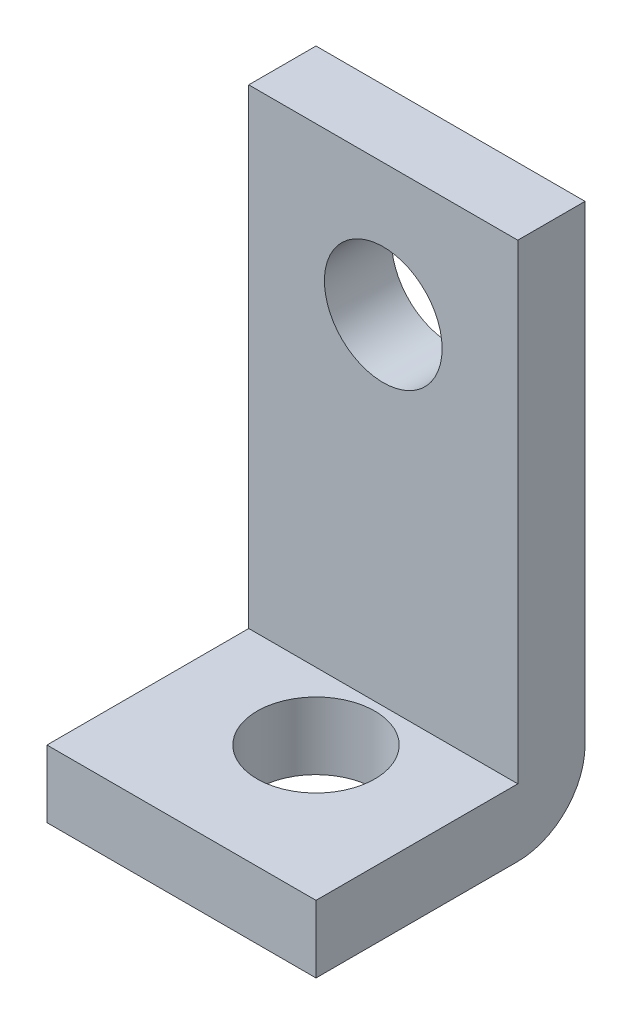
ISO-10303-21;
HEADER;
FILE_DESCRIPTION(('STEP AP214'),'2;1');
FILE_NAME('part.step','',(''),(''),'','','');
FILE_SCHEMA(('AUTOMOTIVE_DESIGN { 1 0 10303 214 1 1 1 1 }'));
ENDSEC;
DATA;
#1=APPLICATION_CONTEXT('core data for automotive mechanical design processes');
#2=APPLICATION_PROTOCOL_DEFINITION('international standard','automotive_design',2000,#1);
#3=PRODUCT_CONTEXT('',#1,'mechanical');
#4=PRODUCT('Part','Part','',(#3));
#5=PRODUCT_RELATED_PRODUCT_CATEGORY('part','',(#4));
#6=PRODUCT_DEFINITION_FORMATION('','',#4);
#7=PRODUCT_DEFINITION_CONTEXT('part definition',#1,'design');
#8=PRODUCT_DEFINITION('design','',#6,#7);
#9=PRODUCT_DEFINITION_SHAPE('','',#8);
#10=(LENGTH_UNIT() NAMED_UNIT(*) SI_UNIT(.MILLI.,.METRE.));
#11=(NAMED_UNIT(*) PLANE_ANGLE_UNIT() SI_UNIT($,.RADIAN.));
#12=(NAMED_UNIT(*) SI_UNIT($,.STERADIAN.) SOLID_ANGLE_UNIT());
#13=UNCERTAINTY_MEASURE_WITH_UNIT(LENGTH_MEASURE(1.E-05),#10,'distance_accuracy_value','');
#14=(GEOMETRIC_REPRESENTATION_CONTEXT(3) GLOBAL_UNCERTAINTY_ASSIGNED_CONTEXT((#13)) GLOBAL_UNIT_ASSIGNED_CONTEXT((#10,
#11,#12)) REPRESENTATION_CONTEXT('',''));
#15=CARTESIAN_POINT('',(0.,0.,0.));
#16=DIRECTION('',(0.,0.,1.));
#17=DIRECTION('',(1.,0.,0.));
#18=AXIS2_PLACEMENT_3D('',#15,#16,#17);
#19=CARTESIAN_POINT('',(-5.08,2.54,0.));
#20=DIRECTION('',(-1.,0.,0.));
#21=DIRECTION('',(0.,0.,1.));
#22=AXIS2_PLACEMENT_3D('',#19,#20,#21);
#23=PLANE('',#22);
#24=DIRECTION('',(0.,-1.,0.));
#25=VECTOR('',#24,1.);
#26=CARTESIAN_POINT('',(-5.08,20.32,-5.08));
#27=LINE('',#26,#25);
#28=CARTESIAN_POINT('',(-5.08,20.32,-5.08));
#29=VERTEX_POINT('',#28);
#30=CARTESIAN_POINT('',(-5.08,2.54,-5.08));
#31=VERTEX_POINT('',#30);
#32=EDGE_CURVE('E143',#29,#31,#27,.T.);
#33=ORIENTED_EDGE('',*,*,#32,.T.);
#34=CARTESIAN_POINT('',(-5.08,2.54,-2.54));
#35=DIRECTION('',(-1.,0.,0.));
#36=DIRECTION('',(0.,0.,1.));
#37=AXIS2_PLACEMENT_3D('',#34,#35,#36);
#38=CIRCLE('',#37,2.54);
#39=CARTESIAN_POINT('',(-5.08,0.,-2.54));
#40=VERTEX_POINT('',#39);
#41=EDGE_CURVE('E11',#31,#40,#38,.T.);
#42=ORIENTED_EDGE('',*,*,#41,.T.);
#43=DIRECTION('',(0.,0.,-1.));
#44=VECTOR('',#43,1.);
#45=CARTESIAN_POINT('',(-5.08,0.,0.));
#46=LINE('',#45,#44);
#47=CARTESIAN_POINT('',(-5.08,0.,5.08));
#48=VERTEX_POINT('',#47);
#49=EDGE_CURVE('E172',#48,#40,#46,.T.);
#50=ORIENTED_EDGE('',*,*,#49,.F.);
#51=DIRECTION('',(0.,-1.,0.));
#52=VECTOR('',#51,1.);
#53=CARTESIAN_POINT('',(-5.08,2.54,5.08));
#54=LINE('',#53,#52);
#55=CARTESIAN_POINT('',(-5.08,2.54,5.08));
#56=VERTEX_POINT('',#55);
#57=EDGE_CURVE('E185',#56,#48,#54,.T.);
#58=ORIENTED_EDGE('',*,*,#57,.F.);
#59=DIRECTION('',(0.,0.,-1.));
#60=VECTOR('',#59,1.);
#61=CARTESIAN_POINT('',(-5.08,2.54,0.));
#62=LINE('',#61,#60);
#63=CARTESIAN_POINT('',(-5.08,2.54,-2.54));
#64=VERTEX_POINT('',#63);
#65=EDGE_CURVE('E111',#56,#64,#62,.T.);
#66=ORIENTED_EDGE('',*,*,#65,.T.);
#67=DIRECTION('',(0.,-1.,0.));
#68=VECTOR('',#67,1.);
#69=CARTESIAN_POINT('',(-5.08,20.32,-2.54));
#70=LINE('',#69,#68);
#71=CARTESIAN_POINT('',(-5.08,20.32,-2.54));
#72=VERTEX_POINT('',#71);
#73=EDGE_CURVE('E105',#72,#64,#70,.T.);
#74=ORIENTED_EDGE('',*,*,#73,.F.);
#75=DIRECTION('',(0.,0.,-1.));
#76=VECTOR('',#75,1.);
#77=CARTESIAN_POINT('',(-5.08,20.32,0.));
#78=LINE('',#77,#76);
#79=EDGE_CURVE('E108',#72,#29,#78,.T.);
#80=ORIENTED_EDGE('',*,*,#79,.T.);
#81=EDGE_LOOP('',(#33,#42,#50,#58,#66,#74,#80));
#82=FACE_BOUND('',#81,.T.);
#83=ADVANCED_FACE('F45',(#82),#23,.T.);
#84=CARTESIAN_POINT('',(0.,2.54,5.08));
#85=DIRECTION('',(0.,0.,-1.));
#86=DIRECTION('',(-1.,0.,0.));
#87=AXIS2_PLACEMENT_3D('',#84,#85,#86);
#88=PLANE('',#87);
#89=DIRECTION('',(1.,0.,0.));
#90=VECTOR('',#89,1.);
#91=CARTESIAN_POINT('',(0.,0.,5.08));
#92=LINE('',#91,#90);
#93=CARTESIAN_POINT('',(5.08,0.,5.08));
#94=VERTEX_POINT('',#93);
#95=EDGE_CURVE('E176',#48,#94,#92,.T.);
#96=ORIENTED_EDGE('',*,*,#95,.T.);
#97=DIRECTION('',(0.,-1.,0.));
#98=VECTOR('',#97,1.);
#99=CARTESIAN_POINT('',(5.08,2.54,5.08));
#100=LINE('',#99,#98);
#101=CARTESIAN_POINT('',(5.08,2.54,5.08));
#102=VERTEX_POINT('',#101);
#103=EDGE_CURVE('E168',#102,#94,#100,.T.);
#104=ORIENTED_EDGE('',*,*,#103,.F.);
#105=DIRECTION('',(1.,0.,0.));
#106=VECTOR('',#105,1.);
#107=CARTESIAN_POINT('',(0.,2.54,5.08));
#108=LINE('',#107,#106);
#109=EDGE_CURVE('E161',#56,#102,#108,.T.);
#110=ORIENTED_EDGE('',*,*,#109,.F.);
#111=ORIENTED_EDGE('',*,*,#57,.T.);
#112=EDGE_LOOP('',(#96,#104,#110,#111));
#113=FACE_BOUND('',#112,.T.);
#114=ADVANCED_FACE('F205',(#113),#88,.F.);
#115=CARTESIAN_POINT('',(0.,2.54,0.));
#116=DIRECTION('',(0.,-1.,0.));
#117=DIRECTION('',(0.,0.,-1.));
#118=AXIS2_PLACEMENT_3D('',#115,#116,#117);
#119=CYLINDRICAL_SURFACE('',#118,2.2225);
#120=CARTESIAN_POINT('',(0.,2.54,0.));
#121=DIRECTION('',(0.,1.,0.));
#122=DIRECTION('',(0.,0.,1.));
#123=AXIS2_PLACEMENT_3D('',#120,#121,#122);
#124=CIRCLE('',#123,2.2225);
#125=CARTESIAN_POINT('',(0.,2.54,2.2225));
#126=VERTEX_POINT('',#125);
#127=EDGE_CURVE('E151',#126,#126,#124,.T.);
#128=ORIENTED_EDGE('',*,*,#127,.T.);
#129=EDGE_LOOP('',(#128));
#130=FACE_BOUND('',#129,.T.);
#131=CARTESIAN_POINT('',(0.,0.,0.));
#132=DIRECTION('',(0.,1.,0.));
#133=DIRECTION('',(0.,0.,1.));
#134=AXIS2_PLACEMENT_3D('',#131,#132,#133);
#135=CIRCLE('',#134,2.2225);
#136=CARTESIAN_POINT('',(0.,0.,2.2225));
#137=VERTEX_POINT('',#136);
#138=EDGE_CURVE('E115',#137,#137,#135,.T.);
#139=ORIENTED_EDGE('',*,*,#138,.F.);
#140=EDGE_LOOP('',(#139));
#141=FACE_BOUND('',#140,.T.);
#142=ADVANCED_FACE('F221',(#130,#141),#119,.F.);
#143=CARTESIAN_POINT('',(5.08,2.54,0.));
#144=DIRECTION('',(-1.,0.,0.));
#145=DIRECTION('',(0.,0.,1.));
#146=AXIS2_PLACEMENT_3D('',#143,#144,#145);
#147=PLANE('',#146);
#148=DIRECTION('',(0.,0.,-1.));
#149=VECTOR('',#148,1.);
#150=CARTESIAN_POINT('',(5.08,0.,0.));
#151=LINE('',#150,#149);
#152=CARTESIAN_POINT('',(5.08,0.,-2.54));
#153=VERTEX_POINT('',#152);
#154=EDGE_CURVE('E156',#94,#153,#151,.T.);
#155=ORIENTED_EDGE('',*,*,#154,.T.);
#156=CARTESIAN_POINT('',(5.08,2.54,-2.54));
#157=DIRECTION('',(-1.,0.,0.));
#158=DIRECTION('',(0.,0.,1.));
#159=AXIS2_PLACEMENT_3D('',#156,#157,#158);
#160=CIRCLE('',#159,2.54);
#161=CARTESIAN_POINT('',(5.08,2.54,-5.08));
#162=VERTEX_POINT('',#161);
#163=EDGE_CURVE('E68',#153,#162,#160,.F.);
#164=ORIENTED_EDGE('',*,*,#163,.T.);
#165=DIRECTION('',(0.,-1.,0.));
#166=VECTOR('',#165,1.);
#167=CARTESIAN_POINT('',(5.08,20.32,-5.08));
#168=LINE('',#167,#166);
#169=CARTESIAN_POINT('',(5.08,20.32,-5.08));
#170=VERTEX_POINT('',#169);
#171=EDGE_CURVE('E146',#170,#162,#168,.T.);
#172=ORIENTED_EDGE('',*,*,#171,.F.);
#173=DIRECTION('',(0.,0.,-1.));
#174=VECTOR('',#173,1.);
#175=CARTESIAN_POINT('',(5.08,20.32,0.));
#176=LINE('',#175,#174);
#177=CARTESIAN_POINT('',(5.08,20.32,-2.54));
#178=VERTEX_POINT('',#177);
#179=EDGE_CURVE('E125',#178,#170,#176,.T.);
#180=ORIENTED_EDGE('',*,*,#179,.F.);
#181=DIRECTION('',(0.,-1.,0.));
#182=VECTOR('',#181,1.);
#183=CARTESIAN_POINT('',(5.08,20.32,-2.54));
#184=LINE('',#183,#182);
#185=CARTESIAN_POINT('',(5.08,2.54,-2.54));
#186=VERTEX_POINT('',#185);
#187=EDGE_CURVE('E116',#178,#186,#184,.T.);
#188=ORIENTED_EDGE('',*,*,#187,.T.);
#189=DIRECTION('',(0.,0.,-1.));
#190=VECTOR('',#189,1.);
#191=CARTESIAN_POINT('',(5.08,2.54,0.));
#192=LINE('',#191,#190);
#193=EDGE_CURVE('E165',#102,#186,#192,.T.);
#194=ORIENTED_EDGE('',*,*,#193,.F.);
#195=ORIENTED_EDGE('',*,*,#103,.T.);
#196=EDGE_LOOP('',(#155,#164,#172,#180,#188,#194,#195));
#197=FACE_BOUND('',#196,.T.);
#198=ADVANCED_FACE('F201',(#197),#147,.F.);
#199=CARTESIAN_POINT('',(0.,2.54,0.));
#200=DIRECTION('',(0.,1.,0.));
#201=DIRECTION('',(0.,0.,1.));
#202=AXIS2_PLACEMENT_3D('',#199,#200,#201);
#203=PLANE('',#202);
#204=ORIENTED_EDGE('',*,*,#127,.F.);
#205=EDGE_LOOP('',(#204));
#206=FACE_BOUND('',#205,.T.);
#207=DIRECTION('',(1.,0.,0.));
#208=VECTOR('',#207,1.);
#209=CARTESIAN_POINT('',(0.,2.54,-2.54));
#210=LINE('',#209,#208);
#211=EDGE_CURVE('E155',#64,#186,#210,.T.);
#212=ORIENTED_EDGE('',*,*,#211,.F.);
#213=ORIENTED_EDGE('',*,*,#65,.F.);
#214=ORIENTED_EDGE('',*,*,#109,.T.);
#215=ORIENTED_EDGE('',*,*,#193,.T.);
#216=EDGE_LOOP('',(#212,#213,#214,#215));
#217=FACE_BOUND('',#216,.T.);
#218=ADVANCED_FACE('F229',(#206,#217),#203,.T.);
#219=CARTESIAN_POINT('',(0.,0.,0.));
#220=DIRECTION('',(0.,1.,0.));
#221=DIRECTION('',(0.,0.,1.));
#222=AXIS2_PLACEMENT_3D('',#219,#220,#221);
#223=PLANE('',#222);
#224=ORIENTED_EDGE('',*,*,#138,.T.);
#225=EDGE_LOOP('',(#224));
#226=FACE_BOUND('',#225,.T.);
#227=ORIENTED_EDGE('',*,*,#49,.T.);
#228=DIRECTION('',(1.,0.,0.));
#229=VECTOR('',#228,1.);
#230=CARTESIAN_POINT('',(5.08,0.,-2.54));
#231=LINE('',#230,#229);
#232=EDGE_CURVE('E188',#40,#153,#231,.T.);
#233=ORIENTED_EDGE('',*,*,#232,.T.);
#234=ORIENTED_EDGE('',*,*,#154,.F.);
#235=ORIENTED_EDGE('',*,*,#95,.F.);
#236=EDGE_LOOP('',(#227,#233,#234,#235));
#237=FACE_BOUND('',#236,.T.);
#238=ADVANCED_FACE('F196',(#226,#237),#223,.F.);
#239=CARTESIAN_POINT('',(0.,20.32,-2.54));
#240=DIRECTION('',(0.,0.,-1.));
#241=DIRECTION('',(-1.,0.,0.));
#242=AXIS2_PLACEMENT_3D('',#239,#240,#241);
#243=PLANE('',#242);
#244=CARTESIAN_POINT('',(0.,15.3416,-2.54));
#245=DIRECTION('',(0.,0.,1.));
#246=DIRECTION('',(1.,0.,0.));
#247=AXIS2_PLACEMENT_3D('',#244,#245,#246);
#248=CIRCLE('',#247,2.2225);
#249=CARTESIAN_POINT('',(2.2225,15.3416,-2.54));
#250=VERTEX_POINT('',#249);
#251=EDGE_CURVE('E131',#250,#250,#248,.T.);
#252=ORIENTED_EDGE('',*,*,#251,.F.);
#253=EDGE_LOOP('',(#252));
#254=FACE_BOUND('',#253,.T.);
#255=ORIENTED_EDGE('',*,*,#73,.T.);
#256=ORIENTED_EDGE('',*,*,#211,.T.);
#257=ORIENTED_EDGE('',*,*,#187,.F.);
#258=DIRECTION('',(1.,0.,0.));
#259=VECTOR('',#258,1.);
#260=CARTESIAN_POINT('',(0.,20.32,-2.54));
#261=LINE('',#260,#259);
#262=EDGE_CURVE('E119',#72,#178,#261,.T.);
#263=ORIENTED_EDGE('',*,*,#262,.F.);
#264=EDGE_LOOP('',(#255,#256,#257,#263));
#265=FACE_BOUND('',#264,.T.);
#266=ADVANCED_FACE('F120',(#254,#265),#243,.F.);
#267=CARTESIAN_POINT('',(0.,20.32,-5.08));
#268=DIRECTION('',(0.,0.,-1.));
#269=DIRECTION('',(-1.,0.,0.));
#270=AXIS2_PLACEMENT_3D('',#267,#268,#269);
#271=PLANE('',#270);
#272=CARTESIAN_POINT('',(0.,15.3416,-5.08));
#273=DIRECTION('',(0.,0.,-1.));
#274=DIRECTION('',(-1.,0.,0.));
#275=AXIS2_PLACEMENT_3D('',#272,#273,#274);
#276=CIRCLE('',#275,2.2225);
#277=CARTESIAN_POINT('',(-2.2225,15.3416,-5.08));
#278=VERTEX_POINT('',#277);
#279=EDGE_CURVE('E135',#278,#278,#276,.F.);
#280=ORIENTED_EDGE('',*,*,#279,.T.);
#281=EDGE_LOOP('',(#280));
#282=FACE_BOUND('',#281,.T.);
#283=ORIENTED_EDGE('',*,*,#171,.T.);
#284=DIRECTION('',(1.,0.,0.));
#285=VECTOR('',#284,1.);
#286=CARTESIAN_POINT('',(-5.08,2.54,-5.08));
#287=LINE('',#286,#285);
#288=EDGE_CURVE('E54',#162,#31,#287,.F.);
#289=ORIENTED_EDGE('',*,*,#288,.T.);
#290=ORIENTED_EDGE('',*,*,#32,.F.);
#291=DIRECTION('',(1.,0.,0.));
#292=VECTOR('',#291,1.);
#293=CARTESIAN_POINT('',(0.,20.32,-5.08));
#294=LINE('',#293,#292);
#295=EDGE_CURVE('E129',#29,#170,#294,.T.);
#296=ORIENTED_EDGE('',*,*,#295,.T.);
#297=EDGE_LOOP('',(#283,#289,#290,#296));
#298=FACE_BOUND('',#297,.T.);
#299=ADVANCED_FACE('F214',(#282,#298),#271,.T.);
#300=CARTESIAN_POINT('',(0.,20.32,0.));
#301=DIRECTION('',(0.,1.,0.));
#302=DIRECTION('',(0.,0.,1.));
#303=AXIS2_PLACEMENT_3D('',#300,#301,#302);
#304=PLANE('',#303);
#305=ORIENTED_EDGE('',*,*,#79,.F.);
#306=ORIENTED_EDGE('',*,*,#262,.T.);
#307=ORIENTED_EDGE('',*,*,#179,.T.);
#308=ORIENTED_EDGE('',*,*,#295,.F.);
#309=EDGE_LOOP('',(#305,#306,#307,#308));
#310=FACE_BOUND('',#309,.T.);
#311=ADVANCED_FACE('F127',(#310),#304,.T.);
#312=CARTESIAN_POINT('',(0.,2.54,-2.54));
#313=DIRECTION('',(-1.,0.,0.));
#314=DIRECTION('',(0.,0.,1.));
#315=AXIS2_PLACEMENT_3D('',#312,#313,#314);
#316=CYLINDRICAL_SURFACE('',#315,2.54);
#317=ORIENTED_EDGE('',*,*,#41,.F.);
#318=ORIENTED_EDGE('',*,*,#288,.F.);
#319=ORIENTED_EDGE('',*,*,#163,.F.);
#320=ORIENTED_EDGE('',*,*,#232,.F.);
#321=EDGE_LOOP('',(#317,#318,#319,#320));
#322=FACE_BOUND('',#321,.T.);
#323=ADVANCED_FACE('F47',(#322),#316,.T.);
#324=CARTESIAN_POINT('',(0.,15.3416,-5.081));
#325=DIRECTION('',(0.,0.,1.));
#326=DIRECTION('',(1.,0.,0.));
#327=AXIS2_PLACEMENT_3D('',#324,#325,#326);
#328=CYLINDRICAL_SURFACE('',#327,2.2225);
#329=ORIENTED_EDGE('',*,*,#279,.F.);
#330=EDGE_LOOP('',(#329));
#331=FACE_BOUND('',#330,.T.);
#332=ORIENTED_EDGE('',*,*,#251,.T.);
#333=EDGE_LOOP('',(#332));
#334=FACE_BOUND('',#333,.T.);
#335=ADVANCED_FACE('F207',(#331,#334),#328,.F.);
#336=CLOSED_SHELL('',(#83,#114,#142,#198,#218,#238,#266,#299,#311,#323,#335));
#337=MANIFOLD_SOLID_BREP('B2',#336);
#338=ADVANCED_BREP_SHAPE_REPRESENTATION('',(#18,#337),#14);
#339=SHAPE_DEFINITION_REPRESENTATION(#9,#338);
ENDSEC;
END-ISO-10303-21;
